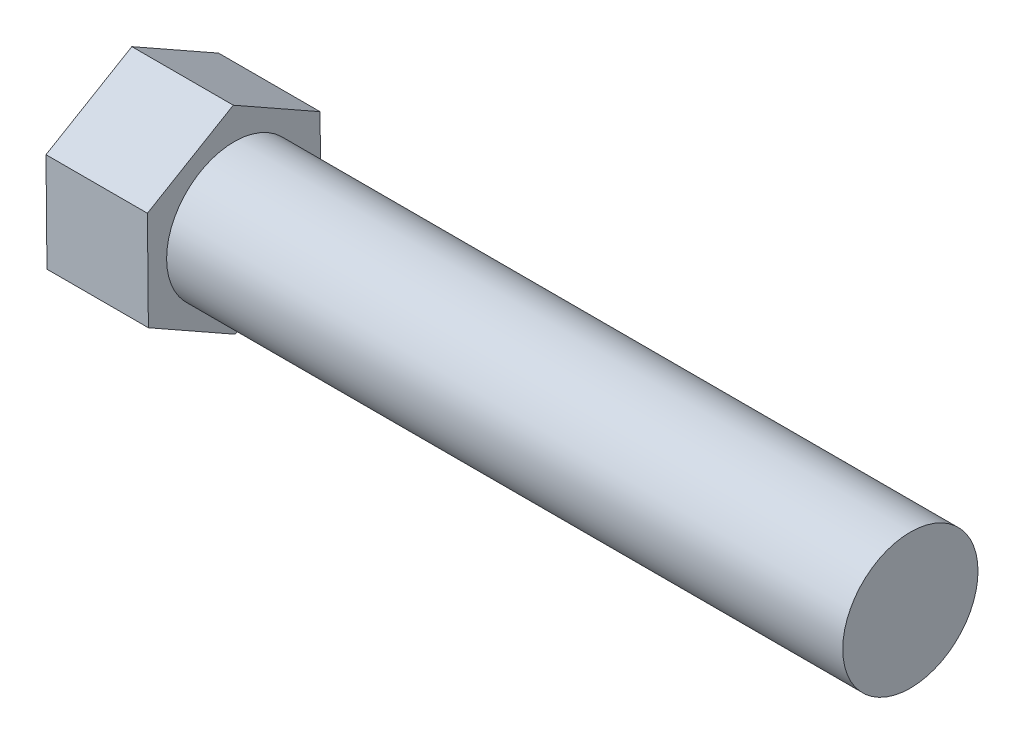
ISO-10303-21;
HEADER;
FILE_DESCRIPTION(('STEP AP214'),'2;1');
FILE_NAME('part.step','',(''),(''),'','','');
FILE_SCHEMA(('AUTOMOTIVE_DESIGN { 1 0 10303 214 1 1 1 1 }'));
ENDSEC;
DATA;
#1=APPLICATION_CONTEXT('core data for automotive mechanical design processes');
#2=APPLICATION_PROTOCOL_DEFINITION('international standard','automotive_design',2000,#1);
#3=PRODUCT_CONTEXT('',#1,'mechanical');
#4=PRODUCT('Part','Part','',(#3));
#5=PRODUCT_RELATED_PRODUCT_CATEGORY('part','',(#4));
#6=PRODUCT_DEFINITION_FORMATION('','',#4);
#7=PRODUCT_DEFINITION_CONTEXT('part definition',#1,'design');
#8=PRODUCT_DEFINITION('design','',#6,#7);
#9=PRODUCT_DEFINITION_SHAPE('','',#8);
#10=(LENGTH_UNIT() NAMED_UNIT(*) SI_UNIT(.MILLI.,.METRE.));
#11=(NAMED_UNIT(*) PLANE_ANGLE_UNIT() SI_UNIT($,.RADIAN.));
#12=(NAMED_UNIT(*) SI_UNIT($,.STERADIAN.) SOLID_ANGLE_UNIT());
#13=UNCERTAINTY_MEASURE_WITH_UNIT(LENGTH_MEASURE(1.E-05),#10,'distance_accuracy_value','');
#14=(GEOMETRIC_REPRESENTATION_CONTEXT(3) GLOBAL_UNCERTAINTY_ASSIGNED_CONTEXT((#13)) GLOBAL_UNIT_ASSIGNED_CONTEXT((#10,
#11,#12)) REPRESENTATION_CONTEXT('',''));
#15=CARTESIAN_POINT('',(0.,0.,0.));
#16=DIRECTION('',(0.,0.,1.));
#17=DIRECTION('',(1.,0.,0.));
#18=AXIS2_PLACEMENT_3D('',#15,#16,#17);
#19=CARTESIAN_POINT('',(40.,0.,0.));
#20=DIRECTION('',(-1.,0.,0.));
#21=DIRECTION('',(0.,0.,1.));
#22=AXIS2_PLACEMENT_3D('',#19,#20,#21);
#23=CYLINDRICAL_SURFACE('',#22,4.);
#24=CARTESIAN_POINT('',(40.,0.,0.));
#25=DIRECTION('',(1.,0.,0.));
#26=DIRECTION('',(0.,0.,-1.));
#27=AXIS2_PLACEMENT_3D('',#24,#25,#26);
#28=CIRCLE('',#27,4.);
#29=CARTESIAN_POINT('',(40.,0.,-4.));
#30=VERTEX_POINT('',#29);
#31=EDGE_CURVE('E13',#30,#30,#28,.T.);
#32=ORIENTED_EDGE('',*,*,#31,.F.);
#33=EDGE_LOOP('',(#32));
#34=FACE_BOUND('',#33,.T.);
#35=CARTESIAN_POINT('',(0.,0.,0.));
#36=DIRECTION('',(-1.,0.,0.));
#37=DIRECTION('',(0.,0.,1.));
#38=AXIS2_PLACEMENT_3D('',#35,#36,#37);
#39=CIRCLE('',#38,4.);
#40=CARTESIAN_POINT('',(0.,0.,4.));
#41=VERTEX_POINT('',#40);
#42=EDGE_CURVE('E54',#41,#41,#39,.T.);
#43=ORIENTED_EDGE('',*,*,#42,.F.);
#44=EDGE_LOOP('',(#43));
#45=FACE_BOUND('',#44,.T.);
#46=ADVANCED_FACE('F46',(#34,#45),#23,.T.);
#47=CARTESIAN_POINT('',(40.,0.,0.));
#48=DIRECTION('',(1.,0.,0.));
#49=DIRECTION('',(0.,0.,-1.));
#50=AXIS2_PLACEMENT_3D('',#47,#48,#49);
#51=PLANE('',#50);
#52=ORIENTED_EDGE('',*,*,#31,.T.);
#53=EDGE_LOOP('',(#52));
#54=FACE_BOUND('',#53,.T.);
#55=ADVANCED_FACE('F156',(#54),#51,.T.);
#56=CARTESIAN_POINT('',(-6.,-5.89605537651018,-0.05631237022055));
#57=DIRECTION('',(0.,0.870761117305026,-0.491706290980402));
#58=DIRECTION('',(0.,0.491706290980402,0.870761117305026));
#59=AXIS2_PLACEMENT_3D('',#56,#57,#58);
#60=PLANE('',#59);
#61=DIRECTION('',(0.,0.491706290980402,0.870761117305026));
#62=VECTOR('',#61,1.);
#63=CARTESIAN_POINT('',(0.,-5.89605537651018,-0.05631237022055));
#64=LINE('',#63,#62);
#65=CARTESIAN_POINT('',(0.,-5.89605537651018,-0.05631237022055));
#66=VERTEX_POINT('',#65);
#67=CARTESIAN_POINT('',(0.,-2.99679563141341,5.07797755306736));
#68=VERTEX_POINT('',#67);
#69=EDGE_CURVE('E131',#66,#68,#64,.T.);
#70=ORIENTED_EDGE('',*,*,#69,.T.);
#71=DIRECTION('',(1.,0.,0.));
#72=VECTOR('',#71,1.);
#73=CARTESIAN_POINT('',(-6.,-2.99679563141341,5.07797755306736));
#74=LINE('',#73,#72);
#75=CARTESIAN_POINT('',(-6.,-2.99679563141341,5.07797755306736));
#76=VERTEX_POINT('',#75);
#77=EDGE_CURVE('E148',#76,#68,#74,.T.);
#78=ORIENTED_EDGE('',*,*,#77,.F.);
#79=DIRECTION('',(0.,0.491706290980402,0.870761117305026));
#80=VECTOR('',#79,1.);
#81=CARTESIAN_POINT('',(-6.,-5.89605537651018,-0.05631237022055));
#82=LINE('',#81,#80);
#83=CARTESIAN_POINT('',(-6.,-5.89605537651018,-0.05631237022055));
#84=VERTEX_POINT('',#83);
#85=EDGE_CURVE('E141',#84,#76,#82,.T.);
#86=ORIENTED_EDGE('',*,*,#85,.F.);
#87=DIRECTION('',(1.,0.,0.));
#88=VECTOR('',#87,1.);
#89=CARTESIAN_POINT('',(-6.,-5.89605537651018,-0.05631237022055));
#90=LINE('',#89,#88);
#91=EDGE_CURVE('E127',#84,#66,#90,.T.);
#92=ORIENTED_EDGE('',*,*,#91,.T.);
#93=EDGE_LOOP('',(#70,#78,#86,#92));
#94=FACE_BOUND('',#93,.T.);
#95=ADVANCED_FACE('F161',(#94),#60,.F.);
#96=CARTESIAN_POINT('',(-6.,-2.99679563141341,5.07797755306736));
#97=DIRECTION('',(0.,0.00955041946286131,-0.999954393704075));
#98=DIRECTION('',(0.,0.999954393704075,0.00955041946286131));
#99=AXIS2_PLACEMENT_3D('',#96,#97,#98);
#100=PLANE('',#99);
#101=DIRECTION('',(0.,0.999954393704075,0.00955041946286131));
#102=VECTOR('',#101,1.);
#103=CARTESIAN_POINT('',(0.,-2.99679563141341,5.07797755306736));
#104=LINE('',#103,#102);
#105=CARTESIAN_POINT('',(0.,2.89925974509677,5.13428992328792));
#106=VERTEX_POINT('',#105);
#107=EDGE_CURVE('E134',#68,#106,#104,.T.);
#108=ORIENTED_EDGE('',*,*,#107,.T.);
#109=DIRECTION('',(1.,0.,0.));
#110=VECTOR('',#109,1.);
#111=CARTESIAN_POINT('',(-6.,2.89925974509677,5.13428992328792));
#112=LINE('',#111,#110);
#113=CARTESIAN_POINT('',(-6.,2.89925974509677,5.13428992328792));
#114=VERTEX_POINT('',#113);
#115=EDGE_CURVE('E145',#114,#106,#112,.T.);
#116=ORIENTED_EDGE('',*,*,#115,.F.);
#117=DIRECTION('',(0.,0.999954393704075,0.00955041946286131));
#118=VECTOR('',#117,1.);
#119=CARTESIAN_POINT('',(-6.,-2.99679563141341,5.07797755306736));
#120=LINE('',#119,#118);
#121=EDGE_CURVE('E100',#76,#114,#120,.T.);
#122=ORIENTED_EDGE('',*,*,#121,.F.);
#123=ORIENTED_EDGE('',*,*,#77,.T.);
#124=EDGE_LOOP('',(#108,#116,#122,#123));
#125=FACE_BOUND('',#124,.T.);
#126=ADVANCED_FACE('F167',(#125),#100,.F.);
#127=CARTESIAN_POINT('',(-6.,2.89925974509677,5.13428992328792));
#128=DIRECTION('',(0.,-0.861210697842164,-0.508248102723673));
#129=DIRECTION('',(0.,0.508248102723673,-0.861210697842164));
#130=AXIS2_PLACEMENT_3D('',#127,#128,#129);
#131=PLANE('',#130);
#132=DIRECTION('',(0.,0.508248102723673,-0.861210697842164));
#133=VECTOR('',#132,1.);
#134=CARTESIAN_POINT('',(0.,2.89925974509677,5.13428992328792));
#135=LINE('',#134,#133);
#136=CARTESIAN_POINT('',(0.,5.89605537651018,0.056312370220555));
#137=VERTEX_POINT('',#136);
#138=EDGE_CURVE('E136',#106,#137,#135,.T.);
#139=ORIENTED_EDGE('',*,*,#138,.T.);
#140=DIRECTION('',(1.,0.,0.));
#141=VECTOR('',#140,1.);
#142=CARTESIAN_POINT('',(-6.,5.89605537651018,0.056312370220555));
#143=LINE('',#142,#141);
#144=CARTESIAN_POINT('',(-6.,5.89605537651018,0.056312370220555));
#145=VERTEX_POINT('',#144);
#146=EDGE_CURVE('E122',#145,#137,#143,.T.);
#147=ORIENTED_EDGE('',*,*,#146,.F.);
#148=DIRECTION('',(0.,0.508248102723673,-0.861210697842164));
#149=VECTOR('',#148,1.);
#150=CARTESIAN_POINT('',(-6.,2.89925974509677,5.13428992328792));
#151=LINE('',#150,#149);
#152=EDGE_CURVE('E113',#114,#145,#151,.T.);
#153=ORIENTED_EDGE('',*,*,#152,.F.);
#154=ORIENTED_EDGE('',*,*,#115,.T.);
#155=EDGE_LOOP('',(#139,#147,#153,#154));
#156=FACE_BOUND('',#155,.T.);
#157=ADVANCED_FACE('F173',(#156),#131,.F.);
#158=CARTESIAN_POINT('',(-6.,5.89605537651018,0.056312370220555));
#159=DIRECTION('',(0.,-0.870761117305026,0.491706290980401));
#160=DIRECTION('',(0.,-0.491706290980402,-0.870761117305026));
#161=AXIS2_PLACEMENT_3D('',#158,#159,#160);
#162=PLANE('',#161);
#163=DIRECTION('',(0.,-0.491706290980401,-0.870761117305026));
#164=VECTOR('',#163,1.);
#165=CARTESIAN_POINT('',(0.,5.89605537651018,0.056312370220555));
#166=LINE('',#165,#164);
#167=CARTESIAN_POINT('',(0.,2.99679563141341,-5.07797755306736));
#168=VERTEX_POINT('',#167);
#169=EDGE_CURVE('E121',#137,#168,#166,.T.);
#170=ORIENTED_EDGE('',*,*,#169,.T.);
#171=DIRECTION('',(1.,0.,0.));
#172=VECTOR('',#171,1.);
#173=CARTESIAN_POINT('',(-6.,2.99679563141341,-5.07797755306736));
#174=LINE('',#173,#172);
#175=CARTESIAN_POINT('',(-6.,2.99679563141341,-5.07797755306736));
#176=VERTEX_POINT('',#175);
#177=EDGE_CURVE('E118',#176,#168,#174,.T.);
#178=ORIENTED_EDGE('',*,*,#177,.F.);
#179=DIRECTION('',(0.,-0.491706290980401,-0.870761117305026));
#180=VECTOR('',#179,1.);
#181=CARTESIAN_POINT('',(-6.,5.89605537651018,0.056312370220555));
#182=LINE('',#181,#180);
#183=EDGE_CURVE('E107',#145,#176,#182,.T.);
#184=ORIENTED_EDGE('',*,*,#183,.F.);
#185=ORIENTED_EDGE('',*,*,#146,.T.);
#186=EDGE_LOOP('',(#170,#178,#184,#185));
#187=FACE_BOUND('',#186,.T.);
#188=ADVANCED_FACE('F119',(#187),#162,.F.);
#189=CARTESIAN_POINT('',(-6.,2.99679563141341,-5.07797755306736));
#190=DIRECTION('',(0.,-0.00955041946286205,0.999954393704075));
#191=DIRECTION('',(0.,-0.999954393704075,-0.00955041946286205));
#192=AXIS2_PLACEMENT_3D('',#189,#190,#191);
#193=PLANE('',#192);
#194=DIRECTION('',(0.,-0.999954393704074,-0.00955041946286205));
#195=VECTOR('',#194,1.);
#196=CARTESIAN_POINT('',(0.,2.99679563141341,-5.07797755306736));
#197=LINE('',#196,#195);
#198=CARTESIAN_POINT('',(0.,-2.89925974509677,-5.13428992328792));
#199=VERTEX_POINT('',#198);
#200=EDGE_CURVE('E85',#168,#199,#197,.T.);
#201=ORIENTED_EDGE('',*,*,#200,.T.);
#202=DIRECTION('',(1.,0.,0.));
#203=VECTOR('',#202,1.);
#204=CARTESIAN_POINT('',(-6.,-2.89925974509677,-5.13428992328792));
#205=LINE('',#204,#203);
#206=CARTESIAN_POINT('',(-6.,-2.89925974509677,-5.13428992328792));
#207=VERTEX_POINT('',#206);
#208=EDGE_CURVE('E123',#207,#199,#205,.T.);
#209=ORIENTED_EDGE('',*,*,#208,.F.);
#210=DIRECTION('',(0.,-0.999954393704074,-0.00955041946286205));
#211=VECTOR('',#210,1.);
#212=CARTESIAN_POINT('',(-6.,2.99679563141341,-5.07797755306736));
#213=LINE('',#212,#211);
#214=EDGE_CURVE('E111',#176,#207,#213,.T.);
#215=ORIENTED_EDGE('',*,*,#214,.F.);
#216=ORIENTED_EDGE('',*,*,#177,.T.);
#217=EDGE_LOOP('',(#201,#209,#215,#216));
#218=FACE_BOUND('',#217,.T.);
#219=ADVANCED_FACE('F125',(#218),#193,.F.);
#220=CARTESIAN_POINT('',(-6.,-2.89925974509677,-5.13428992328792));
#221=DIRECTION('',(0.,0.861210697842164,0.508248102723673));
#222=DIRECTION('',(0.,-0.508248102723673,0.861210697842164));
#223=AXIS2_PLACEMENT_3D('',#220,#221,#222);
#224=PLANE('',#223);
#225=DIRECTION('',(0.,-0.508248102723673,0.861210697842164));
#226=VECTOR('',#225,1.);
#227=CARTESIAN_POINT('',(0.,-2.89925974509677,-5.13428992328792));
#228=LINE('',#227,#226);
#229=EDGE_CURVE('E91',#199,#66,#228,.T.);
#230=ORIENTED_EDGE('',*,*,#229,.T.);
#231=ORIENTED_EDGE('',*,*,#91,.F.);
#232=DIRECTION('',(0.,-0.508248102723673,0.861210697842164));
#233=VECTOR('',#232,1.);
#234=CARTESIAN_POINT('',(-6.,-2.89925974509677,-5.13428992328792));
#235=LINE('',#234,#233);
#236=EDGE_CURVE('E62',#207,#84,#235,.T.);
#237=ORIENTED_EDGE('',*,*,#236,.F.);
#238=ORIENTED_EDGE('',*,*,#208,.T.);
#239=EDGE_LOOP('',(#230,#231,#237,#238));
#240=FACE_BOUND('',#239,.T.);
#241=ADVANCED_FACE('F181',(#240),#224,.F.);
#242=CARTESIAN_POINT('',(-6.,0.,0.));
#243=DIRECTION('',(-1.,0.,0.));
#244=DIRECTION('',(0.,0.,1.));
#245=AXIS2_PLACEMENT_3D('',#242,#243,#244);
#246=PLANE('',#245);
#247=ORIENTED_EDGE('',*,*,#85,.T.);
#248=ORIENTED_EDGE('',*,*,#121,.T.);
#249=ORIENTED_EDGE('',*,*,#152,.T.);
#250=ORIENTED_EDGE('',*,*,#183,.T.);
#251=ORIENTED_EDGE('',*,*,#214,.T.);
#252=ORIENTED_EDGE('',*,*,#236,.T.);
#253=EDGE_LOOP('',(#247,#248,#249,#250,#251,#252));
#254=FACE_BOUND('',#253,.T.);
#255=ADVANCED_FACE('F109',(#254),#246,.T.);
#256=CARTESIAN_POINT('',(0.,0.,0.));
#257=DIRECTION('',(-1.,0.,0.));
#258=DIRECTION('',(0.,0.,1.));
#259=AXIS2_PLACEMENT_3D('',#256,#257,#258);
#260=PLANE('',#259);
#261=ORIENTED_EDGE('',*,*,#42,.T.);
#262=EDGE_LOOP('',(#261));
#263=FACE_BOUND('',#262,.T.);
#264=ORIENTED_EDGE('',*,*,#69,.F.);
#265=ORIENTED_EDGE('',*,*,#229,.F.);
#266=ORIENTED_EDGE('',*,*,#200,.F.);
#267=ORIENTED_EDGE('',*,*,#169,.F.);
#268=ORIENTED_EDGE('',*,*,#138,.F.);
#269=ORIENTED_EDGE('',*,*,#107,.F.);
#270=EDGE_LOOP('',(#264,#265,#266,#267,#268,#269));
#271=FACE_BOUND('',#270,.T.);
#272=ADVANCED_FACE('F152',(#263,#271),#260,.F.);
#273=CLOSED_SHELL('',(#46,#55,#95,#126,#157,#188,#219,#241,#255,#272));
#274=MANIFOLD_SOLID_BREP('B2',#273);
#275=ADVANCED_BREP_SHAPE_REPRESENTATION('',(#18,#274),#14);
#276=SHAPE_DEFINITION_REPRESENTATION(#9,#275);
ENDSEC;
END-ISO-10303-21;
